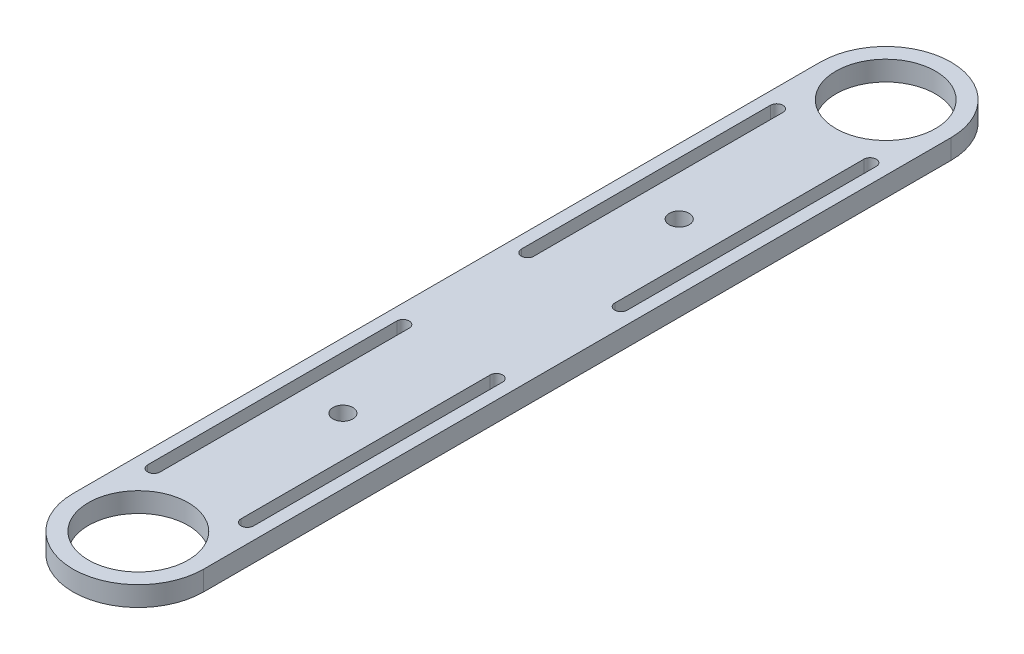
ISO-10303-21;
HEADER;
FILE_DESCRIPTION(('STEP AP214'),'2;1');
FILE_NAME('part.step','',(''),(''),'','','');
FILE_SCHEMA(('AUTOMOTIVE_DESIGN { 1 0 10303 214 1 1 1 1 }'));
ENDSEC;
DATA;
#1=APPLICATION_CONTEXT('core data for automotive mechanical design processes');
#2=APPLICATION_PROTOCOL_DEFINITION('international standard','automotive_design',2000,#1);
#3=PRODUCT_CONTEXT('',#1,'mechanical');
#4=PRODUCT('Part','Part','',(#3));
#5=PRODUCT_RELATED_PRODUCT_CATEGORY('part','',(#4));
#6=PRODUCT_DEFINITION_FORMATION('','',#4);
#7=PRODUCT_DEFINITION_CONTEXT('part definition',#1,'design');
#8=PRODUCT_DEFINITION('design','',#6,#7);
#9=PRODUCT_DEFINITION_SHAPE('','',#8);
#10=(LENGTH_UNIT() NAMED_UNIT(*) SI_UNIT(.MILLI.,.METRE.));
#11=(NAMED_UNIT(*) PLANE_ANGLE_UNIT() SI_UNIT($,.RADIAN.));
#12=(NAMED_UNIT(*) SI_UNIT($,.STERADIAN.) SOLID_ANGLE_UNIT());
#13=UNCERTAINTY_MEASURE_WITH_UNIT(LENGTH_MEASURE(1.E-05),#10,'distance_accuracy_value','');
#14=(GEOMETRIC_REPRESENTATION_CONTEXT(3) GLOBAL_UNCERTAINTY_ASSIGNED_CONTEXT((#13)) GLOBAL_UNIT_ASSIGNED_CONTEXT((#10,
#11,#12)) REPRESENTATION_CONTEXT('',''));
#15=CARTESIAN_POINT('',(0.,0.,0.));
#16=DIRECTION('',(0.,0.,1.));
#17=DIRECTION('',(1.,0.,0.));
#18=AXIS2_PLACEMENT_3D('',#15,#16,#17);
#19=CARTESIAN_POINT('',(0.,3.175,0.));
#20=DIRECTION('',(0.,-1.,0.));
#21=DIRECTION('',(0.,0.,-1.));
#22=AXIS2_PLACEMENT_3D('',#19,#20,#21);
#23=CYLINDRICAL_SURFACE('',#22,10.5);
#24=CARTESIAN_POINT('',(0.,0.,0.));
#25=DIRECTION('',(0.,1.,0.));
#26=DIRECTION('',(0.,0.,1.));
#27=AXIS2_PLACEMENT_3D('',#24,#25,#26);
#28=CIRCLE('',#27,10.5);
#29=CARTESIAN_POINT('',(10.5,0.,0.));
#30=VERTEX_POINT('',#29);
#31=CARTESIAN_POINT('',(-10.5,0.,0.));
#32=VERTEX_POINT('',#31);
#33=EDGE_CURVE('E273',#30,#32,#28,.T.);
#34=ORIENTED_EDGE('',*,*,#33,.T.);
#35=DIRECTION('',(0.,-1.,0.));
#36=VECTOR('',#35,1.);
#37=CARTESIAN_POINT('',(-10.5,3.175,0.));
#38=LINE('',#37,#36);
#39=CARTESIAN_POINT('',(-10.5,3.175,0.));
#40=VERTEX_POINT('',#39);
#41=EDGE_CURVE('E302',#40,#32,#38,.T.);
#42=ORIENTED_EDGE('',*,*,#41,.F.);
#43=CARTESIAN_POINT('',(0.,3.175,0.));
#44=DIRECTION('',(0.,1.,0.));
#45=DIRECTION('',(0.,0.,1.));
#46=AXIS2_PLACEMENT_3D('',#43,#44,#45);
#47=CIRCLE('',#46,10.5);
#48=CARTESIAN_POINT('',(10.5,3.175,0.));
#49=VERTEX_POINT('',#48);
#50=EDGE_CURVE('E276',#49,#40,#47,.T.);
#51=ORIENTED_EDGE('',*,*,#50,.F.);
#52=DIRECTION('',(0.,-1.,0.));
#53=VECTOR('',#52,1.);
#54=CARTESIAN_POINT('',(10.5,3.175,0.));
#55=LINE('',#54,#53);
#56=EDGE_CURVE('E286',#49,#30,#55,.T.);
#57=ORIENTED_EDGE('',*,*,#56,.T.);
#58=EDGE_LOOP('',(#34,#42,#51,#57));
#59=FACE_BOUND('',#58,.T.);
#60=ADVANCED_FACE('F33',(#59),#23,.T.);
#61=CARTESIAN_POINT('',(-10.5,3.175,0.));
#62=DIRECTION('',(1.,0.,0.));
#63=DIRECTION('',(0.,0.,-1.));
#64=AXIS2_PLACEMENT_3D('',#61,#62,#63);
#65=PLANE('',#64);
#66=DIRECTION('',(0.,0.,1.));
#67=VECTOR('',#66,1.);
#68=CARTESIAN_POINT('',(-10.5,0.,0.));
#69=LINE('',#68,#67);
#70=CARTESIAN_POINT('',(-10.5,0.,120.));
#71=VERTEX_POINT('',#70);
#72=EDGE_CURVE('E289',#32,#71,#69,.T.);
#73=ORIENTED_EDGE('',*,*,#72,.T.);
#74=DIRECTION('',(0.,-1.,0.));
#75=VECTOR('',#74,1.);
#76=CARTESIAN_POINT('',(-10.5,3.175,120.));
#77=LINE('',#76,#75);
#78=CARTESIAN_POINT('',(-10.5,3.175,120.));
#79=VERTEX_POINT('',#78);
#80=EDGE_CURVE('E299',#79,#71,#77,.T.);
#81=ORIENTED_EDGE('',*,*,#80,.F.);
#82=DIRECTION('',(0.,0.,1.));
#83=VECTOR('',#82,1.);
#84=CARTESIAN_POINT('',(-10.5,3.175,0.));
#85=LINE('',#84,#83);
#86=EDGE_CURVE('E279',#40,#79,#85,.T.);
#87=ORIENTED_EDGE('',*,*,#86,.F.);
#88=ORIENTED_EDGE('',*,*,#41,.T.);
#89=EDGE_LOOP('',(#73,#81,#87,#88));
#90=FACE_BOUND('',#89,.T.);
#91=ADVANCED_FACE('F368',(#90),#65,.F.);
#92=CARTESIAN_POINT('',(0.,3.175,120.));
#93=DIRECTION('',(0.,-1.,0.));
#94=DIRECTION('',(0.,0.,-1.));
#95=AXIS2_PLACEMENT_3D('',#92,#93,#94);
#96=CYLINDRICAL_SURFACE('',#95,10.5);
#97=CARTESIAN_POINT('',(0.,0.,120.));
#98=DIRECTION('',(0.,1.,0.));
#99=DIRECTION('',(0.,0.,1.));
#100=AXIS2_PLACEMENT_3D('',#97,#98,#99);
#101=CIRCLE('',#100,10.5);
#102=CARTESIAN_POINT('',(10.5,0.,120.));
#103=VERTEX_POINT('',#102);
#104=EDGE_CURVE('E291',#71,#103,#101,.T.);
#105=ORIENTED_EDGE('',*,*,#104,.T.);
#106=DIRECTION('',(0.,-1.,0.));
#107=VECTOR('',#106,1.);
#108=CARTESIAN_POINT('',(10.5,3.175,120.));
#109=LINE('',#108,#107);
#110=CARTESIAN_POINT('',(10.5,3.175,120.));
#111=VERTEX_POINT('',#110);
#112=EDGE_CURVE('E296',#111,#103,#109,.T.);
#113=ORIENTED_EDGE('',*,*,#112,.F.);
#114=CARTESIAN_POINT('',(0.,3.175,120.));
#115=DIRECTION('',(0.,1.,0.));
#116=DIRECTION('',(0.,0.,1.));
#117=AXIS2_PLACEMENT_3D('',#114,#115,#116);
#118=CIRCLE('',#117,10.5);
#119=EDGE_CURVE('E282',#79,#111,#118,.T.);
#120=ORIENTED_EDGE('',*,*,#119,.F.);
#121=ORIENTED_EDGE('',*,*,#80,.T.);
#122=EDGE_LOOP('',(#105,#113,#120,#121));
#123=FACE_BOUND('',#122,.T.);
#124=ADVANCED_FACE('F373',(#123),#96,.T.);
#125=CARTESIAN_POINT('',(10.5,3.175,0.));
#126=DIRECTION('',(-1.,0.,0.));
#127=DIRECTION('',(0.,0.,1.));
#128=AXIS2_PLACEMENT_3D('',#125,#126,#127);
#129=PLANE('',#128);
#130=DIRECTION('',(0.,0.,-1.));
#131=VECTOR('',#130,1.);
#132=CARTESIAN_POINT('',(10.5,0.,0.));
#133=LINE('',#132,#131);
#134=EDGE_CURVE('E280',#103,#30,#133,.T.);
#135=ORIENTED_EDGE('',*,*,#134,.T.);
#136=ORIENTED_EDGE('',*,*,#56,.F.);
#137=DIRECTION('',(0.,0.,-1.));
#138=VECTOR('',#137,1.);
#139=CARTESIAN_POINT('',(10.5,3.175,0.));
#140=LINE('',#139,#138);
#141=EDGE_CURVE('E284',#111,#49,#140,.T.);
#142=ORIENTED_EDGE('',*,*,#141,.F.);
#143=ORIENTED_EDGE('',*,*,#112,.T.);
#144=EDGE_LOOP('',(#135,#136,#142,#143));
#145=FACE_BOUND('',#144,.T.);
#146=ADVANCED_FACE('F388',(#145),#129,.F.);
#147=CARTESIAN_POINT('',(0.,3.175,0.));
#148=DIRECTION('',(0.,1.,0.));
#149=DIRECTION('',(0.,0.,1.));
#150=AXIS2_PLACEMENT_3D('',#147,#148,#149);
#151=PLANE('',#150);
#152=CARTESIAN_POINT('',(0.,3.175,4.36317648677687E-11));
#153=DIRECTION('',(0.,1.,0.));
#154=DIRECTION('',(0.,0.,1.));
#155=AXIS2_PLACEMENT_3D('',#152,#153,#154);
#156=CIRCLE('',#155,8.);
#157=CARTESIAN_POINT('',(0.,3.175,8.00000000004363));
#158=VERTEX_POINT('',#157);
#159=EDGE_CURVE('E486',#158,#158,#156,.T.);
#160=ORIENTED_EDGE('',*,*,#159,.F.);
#161=EDGE_LOOP('',(#160));
#162=FACE_BOUND('',#161,.T.);
#163=CARTESIAN_POINT('',(1.71307412699662E-10,3.175,119.999999999655));
#164=DIRECTION('',(0.,1.,0.));
#165=DIRECTION('',(0.,0.,1.));
#166=AXIS2_PLACEMENT_3D('',#163,#164,#165);
#167=CIRCLE('',#166,7.99999999999998);
#168=CARTESIAN_POINT('',(1.71307412699662E-10,3.175,127.999999999655));
#169=VERTEX_POINT('',#168);
#170=EDGE_CURVE('E490',#169,#169,#167,.T.);
#171=ORIENTED_EDGE('',*,*,#170,.F.);
#172=EDGE_LOOP('',(#171));
#173=FACE_BOUND('',#172,.T.);
#174=CARTESIAN_POINT('',(0.,3.175,33.1500000000001));
#175=DIRECTION('',(0.,1.,0.));
#176=DIRECTION('',(0.,0.,1.));
#177=AXIS2_PLACEMENT_3D('',#174,#175,#176);
#178=CIRCLE('',#177,1.6);
#179=CARTESIAN_POINT('',(0.,3.175,34.7500000000001));
#180=VERTEX_POINT('',#179);
#181=EDGE_CURVE('E206',#180,#180,#178,.T.);
#182=ORIENTED_EDGE('',*,*,#181,.F.);
#183=EDGE_LOOP('',(#182));
#184=FACE_BOUND('',#183,.T.);
#185=CARTESIAN_POINT('',(0.,3.175,87.1500000000001));
#186=DIRECTION('',(0.,1.,0.));
#187=DIRECTION('',(0.,0.,1.));
#188=AXIS2_PLACEMENT_3D('',#185,#186,#187);
#189=CIRCLE('',#188,1.59999999999999);
#190=CARTESIAN_POINT('',(0.,3.175,88.7500000000001));
#191=VERTEX_POINT('',#190);
#192=EDGE_CURVE('E503',#191,#191,#189,.T.);
#193=ORIENTED_EDGE('',*,*,#192,.F.);
#194=EDGE_LOOP('',(#193));
#195=FACE_BOUND('',#194,.T.);
#196=CARTESIAN_POINT('',(-7.50000000000003,3.175,50.));
#197=DIRECTION('',(0.,-1.,0.));
#198=DIRECTION('',(0.,0.,-1.));
#199=AXIS2_PLACEMENT_3D('',#196,#197,#198);
#200=CIRCLE('',#199,0.999999999999999);
#201=CARTESIAN_POINT('',(-6.50000000000003,3.175,50.));
#202=VERTEX_POINT('',#201);
#203=CARTESIAN_POINT('',(-8.50000000000002,3.175,50.));
#204=VERTEX_POINT('',#203);
#205=EDGE_CURVE('E238',#202,#204,#200,.T.);
#206=ORIENTED_EDGE('',*,*,#205,.T.);
#207=DIRECTION('',(0.,0.,-1.));
#208=VECTOR('',#207,1.);
#209=CARTESIAN_POINT('',(-8.50000000000002,3.175,50.));
#210=LINE('',#209,#208);
#211=CARTESIAN_POINT('',(-8.50000000000002,3.175,10.));
#212=VERTEX_POINT('',#211);
#213=EDGE_CURVE('E241',#204,#212,#210,.T.);
#214=ORIENTED_EDGE('',*,*,#213,.T.);
#215=CARTESIAN_POINT('',(-7.50000000000003,3.175,10.));
#216=DIRECTION('',(0.,-1.,0.));
#217=DIRECTION('',(0.,0.,-1.));
#218=AXIS2_PLACEMENT_3D('',#215,#216,#217);
#219=CIRCLE('',#218,0.999999999999999);
#220=CARTESIAN_POINT('',(-6.50000000000003,3.175,10.));
#221=VERTEX_POINT('',#220);
#222=EDGE_CURVE('E49',#212,#221,#219,.T.);
#223=ORIENTED_EDGE('',*,*,#222,.T.);
#224=DIRECTION('',(0.,0.,1.));
#225=VECTOR('',#224,1.);
#226=CARTESIAN_POINT('',(-6.50000000000003,3.175,10.));
#227=LINE('',#226,#225);
#228=EDGE_CURVE('E245',#221,#202,#227,.T.);
#229=ORIENTED_EDGE('',*,*,#228,.T.);
#230=EDGE_LOOP('',(#206,#214,#223,#229));
#231=FACE_BOUND('',#230,.T.);
#232=CARTESIAN_POINT('',(7.49999999999997,3.175,10.));
#233=DIRECTION('',(0.,-1.,0.));
#234=DIRECTION('',(0.,0.,-1.));
#235=AXIS2_PLACEMENT_3D('',#232,#233,#234);
#236=CIRCLE('',#235,0.999999999999997);
#237=CARTESIAN_POINT('',(6.49999999999997,3.175,10.));
#238=VERTEX_POINT('',#237);
#239=CARTESIAN_POINT('',(8.49999999999997,3.175,10.));
#240=VERTEX_POINT('',#239);
#241=EDGE_CURVE('E218',#238,#240,#236,.T.);
#242=ORIENTED_EDGE('',*,*,#241,.T.);
#243=DIRECTION('',(0.,0.,1.));
#244=VECTOR('',#243,1.);
#245=CARTESIAN_POINT('',(8.49999999999997,3.175,10.));
#246=LINE('',#245,#244);
#247=CARTESIAN_POINT('',(8.49999999999997,3.175,50.));
#248=VERTEX_POINT('',#247);
#249=EDGE_CURVE('E221',#240,#248,#246,.T.);
#250=ORIENTED_EDGE('',*,*,#249,.T.);
#251=CARTESIAN_POINT('',(7.49999999999997,3.175,50.));
#252=DIRECTION('',(0.,-1.,0.));
#253=DIRECTION('',(0.,0.,-1.));
#254=AXIS2_PLACEMENT_3D('',#251,#252,#253);
#255=CIRCLE('',#254,0.999999999999999);
#256=CARTESIAN_POINT('',(6.49999999999997,3.175,50.));
#257=VERTEX_POINT('',#256);
#258=EDGE_CURVE('E225',#248,#257,#255,.T.);
#259=ORIENTED_EDGE('',*,*,#258,.T.);
#260=DIRECTION('',(0.,0.,-1.));
#261=VECTOR('',#260,1.);
#262=CARTESIAN_POINT('',(6.49999999999997,3.175,50.));
#263=LINE('',#262,#261);
#264=EDGE_CURVE('E228',#257,#238,#263,.T.);
#265=ORIENTED_EDGE('',*,*,#264,.T.);
#266=EDGE_LOOP('',(#242,#250,#259,#265));
#267=FACE_BOUND('',#266,.T.);
#268=CARTESIAN_POINT('',(7.49999999999984,3.175,110.));
#269=DIRECTION('',(0.,-1.,0.));
#270=DIRECTION('',(0.,0.,-1.));
#271=AXIS2_PLACEMENT_3D('',#268,#269,#270);
#272=CIRCLE('',#271,0.999999999999999);
#273=CARTESIAN_POINT('',(8.49999999999997,3.175,110.));
#274=VERTEX_POINT('',#273);
#275=CARTESIAN_POINT('',(6.49999999999997,3.175,110.));
#276=VERTEX_POINT('',#275);
#277=EDGE_CURVE('E179',#274,#276,#272,.T.);
#278=ORIENTED_EDGE('',*,*,#277,.T.);
#279=DIRECTION('',(0.,0.,-1.));
#280=VECTOR('',#279,1.);
#281=CARTESIAN_POINT('',(6.49999999999997,3.175,110.));
#282=LINE('',#281,#280);
#283=CARTESIAN_POINT('',(6.49999999999994,3.175,70.));
#284=VERTEX_POINT('',#283);
#285=EDGE_CURVE('E190',#276,#284,#282,.T.);
#286=ORIENTED_EDGE('',*,*,#285,.T.);
#287=CARTESIAN_POINT('',(7.49999999999994,3.175,70.0000000000001));
#288=DIRECTION('',(0.,-1.,0.));
#289=DIRECTION('',(0.,0.,-1.));
#290=AXIS2_PLACEMENT_3D('',#287,#288,#289);
#291=CIRCLE('',#290,1.00000000000001);
#292=CARTESIAN_POINT('',(8.49999999999997,3.175,70.));
#293=VERTEX_POINT('',#292);
#294=EDGE_CURVE('E195',#284,#293,#291,.T.);
#295=ORIENTED_EDGE('',*,*,#294,.T.);
#296=DIRECTION('',(0.,0.,1.));
#297=VECTOR('',#296,1.);
#298=CARTESIAN_POINT('',(8.49999999999997,3.175,70.));
#299=LINE('',#298,#297);
#300=EDGE_CURVE('E186',#293,#274,#299,.T.);
#301=ORIENTED_EDGE('',*,*,#300,.T.);
#302=EDGE_LOOP('',(#278,#286,#295,#301));
#303=FACE_BOUND('',#302,.T.);
#304=CARTESIAN_POINT('',(-7.50000000000005,3.175,70.));
#305=DIRECTION('',(0.,-1.,0.));
#306=DIRECTION('',(0.,0.,-1.));
#307=AXIS2_PLACEMENT_3D('',#304,#305,#306);
#308=CIRCLE('',#307,0.999999999999999);
#309=CARTESIAN_POINT('',(-8.50000000000002,3.175,70.));
#310=VERTEX_POINT('',#309);
#311=CARTESIAN_POINT('',(-6.50000000000003,3.175,70.));
#312=VERTEX_POINT('',#311);
#313=EDGE_CURVE('E215',#310,#312,#308,.T.);
#314=ORIENTED_EDGE('',*,*,#313,.T.);
#315=DIRECTION('',(0.,0.,1.));
#316=VECTOR('',#315,1.);
#317=CARTESIAN_POINT('',(-6.50000000000003,3.175,70.));
#318=LINE('',#317,#316);
#319=CARTESIAN_POINT('',(-6.50000000000003,3.175,110.));
#320=VERTEX_POINT('',#319);
#321=EDGE_CURVE('E258',#312,#320,#318,.T.);
#322=ORIENTED_EDGE('',*,*,#321,.T.);
#323=CARTESIAN_POINT('',(-7.50000000000016,3.175,110.));
#324=DIRECTION('',(0.,-1.,0.));
#325=DIRECTION('',(0.,0.,-1.));
#326=AXIS2_PLACEMENT_3D('',#323,#324,#325);
#327=CIRCLE('',#326,1.00000000000007);
#328=CARTESIAN_POINT('',(-8.50000000000016,3.175,110.));
#329=VERTEX_POINT('',#328);
#330=EDGE_CURVE('E113',#320,#329,#327,.T.);
#331=ORIENTED_EDGE('',*,*,#330,.T.);
#332=DIRECTION('',(0.,0.,-1.));
#333=VECTOR('',#332,1.);
#334=CARTESIAN_POINT('',(-8.50000000000016,3.175,110.));
#335=LINE('',#334,#333);
#336=EDGE_CURVE('E262',#329,#310,#335,.T.);
#337=ORIENTED_EDGE('',*,*,#336,.T.);
#338=EDGE_LOOP('',(#314,#322,#331,#337));
#339=FACE_BOUND('',#338,.T.);
#340=ORIENTED_EDGE('',*,*,#50,.T.);
#341=ORIENTED_EDGE('',*,*,#86,.T.);
#342=ORIENTED_EDGE('',*,*,#119,.T.);
#343=ORIENTED_EDGE('',*,*,#141,.T.);
#344=EDGE_LOOP('',(#340,#341,#342,#343));
#345=FACE_BOUND('',#344,.T.);
#346=ADVANCED_FACE('F197',(#162,#173,#184,#195,#231,#267,#303,#339,#345),#151,.T.);
#347=CARTESIAN_POINT('',(0.,0.,0.));
#348=DIRECTION('',(0.,1.,0.));
#349=DIRECTION('',(0.,0.,1.));
#350=AXIS2_PLACEMENT_3D('',#347,#348,#349);
#351=PLANE('',#350);
#352=CARTESIAN_POINT('',(0.,0.,4.36317648677687E-11));
#353=DIRECTION('',(0.,1.,0.));
#354=DIRECTION('',(0.,0.,1.));
#355=AXIS2_PLACEMENT_3D('',#352,#353,#354);
#356=CIRCLE('',#355,8.);
#357=CARTESIAN_POINT('',(0.,0.,8.00000000004363));
#358=VERTEX_POINT('',#357);
#359=EDGE_CURVE('E489',#358,#358,#356,.T.);
#360=ORIENTED_EDGE('',*,*,#359,.T.);
#361=EDGE_LOOP('',(#360));
#362=FACE_BOUND('',#361,.T.);
#363=CARTESIAN_POINT('',(1.71307412699662E-10,0.,119.999999999655));
#364=DIRECTION('',(0.,1.,0.));
#365=DIRECTION('',(0.,0.,1.));
#366=AXIS2_PLACEMENT_3D('',#363,#364,#365);
#367=CIRCLE('',#366,7.99999999999998);
#368=CARTESIAN_POINT('',(1.71307412699662E-10,0.,127.999999999655));
#369=VERTEX_POINT('',#368);
#370=EDGE_CURVE('E491',#369,#369,#367,.T.);
#371=ORIENTED_EDGE('',*,*,#370,.T.);
#372=EDGE_LOOP('',(#371));
#373=FACE_BOUND('',#372,.T.);
#374=CARTESIAN_POINT('',(0.,0.,33.1500000000001));
#375=DIRECTION('',(0.,1.,0.));
#376=DIRECTION('',(0.,0.,1.));
#377=AXIS2_PLACEMENT_3D('',#374,#375,#376);
#378=CIRCLE('',#377,1.6);
#379=CARTESIAN_POINT('',(0.,0.,34.7500000000001));
#380=VERTEX_POINT('',#379);
#381=EDGE_CURVE('E500',#380,#380,#378,.T.);
#382=ORIENTED_EDGE('',*,*,#381,.T.);
#383=EDGE_LOOP('',(#382));
#384=FACE_BOUND('',#383,.T.);
#385=CARTESIAN_POINT('',(0.,0.,87.1500000000001));
#386=DIRECTION('',(0.,1.,0.));
#387=DIRECTION('',(0.,0.,1.));
#388=AXIS2_PLACEMENT_3D('',#385,#386,#387);
#389=CIRCLE('',#388,1.59999999999999);
#390=CARTESIAN_POINT('',(0.,0.,88.7500000000001));
#391=VERTEX_POINT('',#390);
#392=EDGE_CURVE('E499',#391,#391,#389,.T.);
#393=ORIENTED_EDGE('',*,*,#392,.T.);
#394=EDGE_LOOP('',(#393));
#395=FACE_BOUND('',#394,.T.);
#396=DIRECTION('',(0.,0.,1.));
#397=VECTOR('',#396,1.);
#398=CARTESIAN_POINT('',(-8.50000000000002,0.,0.));
#399=LINE('',#398,#397);
#400=CARTESIAN_POINT('',(-8.50000000000002,0.,10.));
#401=VERTEX_POINT('',#400);
#402=CARTESIAN_POINT('',(-8.50000000000002,0.,50.));
#403=VERTEX_POINT('',#402);
#404=EDGE_CURVE('E338',#401,#403,#399,.T.);
#405=ORIENTED_EDGE('',*,*,#404,.T.);
#406=CARTESIAN_POINT('',(-7.50000000000003,0.,50.));
#407=DIRECTION('',(0.,-1.,0.));
#408=DIRECTION('',(0.,0.,-1.));
#409=AXIS2_PLACEMENT_3D('',#406,#407,#408);
#410=CIRCLE('',#409,0.999999999999999);
#411=CARTESIAN_POINT('',(-6.50000000000003,0.,50.));
#412=VERTEX_POINT('',#411);
#413=EDGE_CURVE('E11',#403,#412,#410,.F.);
#414=ORIENTED_EDGE('',*,*,#413,.T.);
#415=DIRECTION('',(0.,0.,1.));
#416=VECTOR('',#415,1.);
#417=CARTESIAN_POINT('',(-6.50000000000003,0.,0.));
#418=LINE('',#417,#416);
#419=CARTESIAN_POINT('',(-6.50000000000003,0.,10.));
#420=VERTEX_POINT('',#419);
#421=EDGE_CURVE('E41',#412,#420,#418,.F.);
#422=ORIENTED_EDGE('',*,*,#421,.T.);
#423=CARTESIAN_POINT('',(-7.50000000000003,0.,10.));
#424=DIRECTION('',(0.,-1.,0.));
#425=DIRECTION('',(0.,0.,-1.));
#426=AXIS2_PLACEMENT_3D('',#423,#424,#425);
#427=CIRCLE('',#426,0.999999999999999);
#428=EDGE_CURVE('E341',#420,#401,#427,.F.);
#429=ORIENTED_EDGE('',*,*,#428,.T.);
#430=EDGE_LOOP('',(#405,#414,#422,#429));
#431=FACE_BOUND('',#430,.T.);
#432=DIRECTION('',(0.,0.,1.));
#433=VECTOR('',#432,1.);
#434=CARTESIAN_POINT('',(8.49999999999997,0.,0.));
#435=LINE('',#434,#433);
#436=CARTESIAN_POINT('',(8.49999999999997,0.,50.));
#437=VERTEX_POINT('',#436);
#438=CARTESIAN_POINT('',(8.49999999999997,0.,10.));
#439=VERTEX_POINT('',#438);
#440=EDGE_CURVE('E326',#437,#439,#435,.F.);
#441=ORIENTED_EDGE('',*,*,#440,.T.);
#442=CARTESIAN_POINT('',(7.49999999999997,0.,10.));
#443=DIRECTION('',(0.,-1.,0.));
#444=DIRECTION('',(0.,0.,-1.));
#445=AXIS2_PLACEMENT_3D('',#442,#443,#444);
#446=CIRCLE('',#445,0.999999999999997);
#447=CARTESIAN_POINT('',(6.49999999999997,0.,10.));
#448=VERTEX_POINT('',#447);
#449=EDGE_CURVE('E335',#439,#448,#446,.F.);
#450=ORIENTED_EDGE('',*,*,#449,.T.);
#451=DIRECTION('',(0.,0.,1.));
#452=VECTOR('',#451,1.);
#453=CARTESIAN_POINT('',(6.49999999999997,0.,0.));
#454=LINE('',#453,#452);
#455=CARTESIAN_POINT('',(6.49999999999997,0.,50.));
#456=VERTEX_POINT('',#455);
#457=EDGE_CURVE('E332',#448,#456,#454,.T.);
#458=ORIENTED_EDGE('',*,*,#457,.T.);
#459=CARTESIAN_POINT('',(7.49999999999997,0.,50.));
#460=DIRECTION('',(0.,-1.,0.));
#461=DIRECTION('',(0.,0.,-1.));
#462=AXIS2_PLACEMENT_3D('',#459,#460,#461);
#463=CIRCLE('',#462,0.999999999999999);
#464=EDGE_CURVE('E329',#456,#437,#463,.F.);
#465=ORIENTED_EDGE('',*,*,#464,.T.);
#466=EDGE_LOOP('',(#441,#450,#458,#465));
#467=FACE_BOUND('',#466,.T.);
#468=DIRECTION('',(0.,0.,1.));
#469=VECTOR('',#468,1.);
#470=CARTESIAN_POINT('',(6.49999999999994,0.,0.));
#471=LINE('',#470,#469);
#472=CARTESIAN_POINT('',(6.49999999999993,0.,70.));
#473=VERTEX_POINT('',#472);
#474=CARTESIAN_POINT('',(6.49999999999996,0.,110.));
#475=VERTEX_POINT('',#474);
#476=EDGE_CURVE('E317',#473,#475,#471,.T.);
#477=ORIENTED_EDGE('',*,*,#476,.T.);
#478=CARTESIAN_POINT('',(7.49999999999984,0.,110.));
#479=DIRECTION('',(0.,-1.,0.));
#480=DIRECTION('',(0.,0.,-1.));
#481=AXIS2_PLACEMENT_3D('',#478,#479,#480);
#482=CIRCLE('',#481,0.999999999999999);
#483=CARTESIAN_POINT('',(8.49999999999997,0.,110.));
#484=VERTEX_POINT('',#483);
#485=EDGE_CURVE('E182',#475,#484,#482,.F.);
#486=ORIENTED_EDGE('',*,*,#485,.T.);
#487=DIRECTION('',(0.,0.,1.));
#488=VECTOR('',#487,1.);
#489=CARTESIAN_POINT('',(8.49999999999997,0.,0.));
#490=LINE('',#489,#488);
#491=CARTESIAN_POINT('',(8.49999999999997,0.,70.));
#492=VERTEX_POINT('',#491);
#493=EDGE_CURVE('E322',#484,#492,#490,.F.);
#494=ORIENTED_EDGE('',*,*,#493,.T.);
#495=CARTESIAN_POINT('',(7.49999999999994,0.,70.0000000000001));
#496=DIRECTION('',(0.,-1.,0.));
#497=DIRECTION('',(0.,0.,-1.));
#498=AXIS2_PLACEMENT_3D('',#495,#496,#497);
#499=CIRCLE('',#498,1.00000000000001);
#500=EDGE_CURVE('E319',#492,#473,#499,.F.);
#501=ORIENTED_EDGE('',*,*,#500,.T.);
#502=EDGE_LOOP('',(#477,#486,#494,#501));
#503=FACE_BOUND('',#502,.T.);
#504=DIRECTION('',(0.,0.,1.));
#505=VECTOR('',#504,1.);
#506=CARTESIAN_POINT('',(-6.50000000000003,0.,0.));
#507=LINE('',#506,#505);
#508=CARTESIAN_POINT('',(-6.50000000000006,0.,110.));
#509=VERTEX_POINT('',#508);
#510=CARTESIAN_POINT('',(-6.50000000000003,0.,70.));
#511=VERTEX_POINT('',#510);
#512=EDGE_CURVE('E305',#509,#511,#507,.F.);
#513=ORIENTED_EDGE('',*,*,#512,.T.);
#514=CARTESIAN_POINT('',(-7.50000000000005,0.,70.));
#515=DIRECTION('',(0.,-1.,0.));
#516=DIRECTION('',(0.,0.,-1.));
#517=AXIS2_PLACEMENT_3D('',#514,#515,#516);
#518=CIRCLE('',#517,0.999999999999999);
#519=CARTESIAN_POINT('',(-8.50000000000002,0.,70.));
#520=VERTEX_POINT('',#519);
#521=EDGE_CURVE('E314',#511,#520,#518,.F.);
#522=ORIENTED_EDGE('',*,*,#521,.T.);
#523=DIRECTION('',(0.,0.,1.));
#524=VECTOR('',#523,1.);
#525=CARTESIAN_POINT('',(-8.50000000000002,0.,0.));
#526=LINE('',#525,#524);
#527=CARTESIAN_POINT('',(-8.50000000000009,0.,110.));
#528=VERTEX_POINT('',#527);
#529=EDGE_CURVE('E311',#520,#528,#526,.T.);
#530=ORIENTED_EDGE('',*,*,#529,.T.);
#531=CARTESIAN_POINT('',(-7.50000000000016,0.,110.));
#532=DIRECTION('',(0.,-1.,0.));
#533=DIRECTION('',(0.,0.,-1.));
#534=AXIS2_PLACEMENT_3D('',#531,#532,#533);
#535=CIRCLE('',#534,1.00000000000007);
#536=EDGE_CURVE('E308',#528,#509,#535,.F.);
#537=ORIENTED_EDGE('',*,*,#536,.T.);
#538=EDGE_LOOP('',(#513,#522,#530,#537));
#539=FACE_BOUND('',#538,.T.);
#540=ORIENTED_EDGE('',*,*,#33,.F.);
#541=ORIENTED_EDGE('',*,*,#134,.F.);
#542=ORIENTED_EDGE('',*,*,#104,.F.);
#543=ORIENTED_EDGE('',*,*,#72,.F.);
#544=EDGE_LOOP('',(#540,#541,#542,#543));
#545=FACE_BOUND('',#544,.T.);
#546=ADVANCED_FACE('F346',(#362,#373,#384,#395,#431,#467,#503,#539,#545),#351,.F.);
#547=CARTESIAN_POINT('',(-7.50000000000005,3.175,70.));
#548=DIRECTION('',(0.,-1.,0.));
#549=DIRECTION('',(0.,0.,-1.));
#550=AXIS2_PLACEMENT_3D('',#547,#548,#549);
#551=CYLINDRICAL_SURFACE('',#550,0.999999999999999);
#552=DIRECTION('',(0.,-1.,0.));
#553=VECTOR('',#552,1.);
#554=CARTESIAN_POINT('',(-6.50000000000003,3.175,70.));
#555=LINE('',#554,#553);
#556=EDGE_CURVE('E265',#312,#511,#555,.T.);
#557=ORIENTED_EDGE('',*,*,#556,.F.);
#558=ORIENTED_EDGE('',*,*,#313,.F.);
#559=DIRECTION('',(0.,-1.,0.));
#560=VECTOR('',#559,1.);
#561=CARTESIAN_POINT('',(-8.50000000000002,3.175,70.));
#562=LINE('',#561,#560);
#563=EDGE_CURVE('E269',#310,#520,#562,.T.);
#564=ORIENTED_EDGE('',*,*,#563,.T.);
#565=ORIENTED_EDGE('',*,*,#521,.F.);
#566=EDGE_LOOP('',(#557,#558,#564,#565));
#567=FACE_BOUND('',#566,.T.);
#568=ADVANCED_FACE('F399',(#567),#551,.F.);
#569=CARTESIAN_POINT('',(-8.50000000000016,3.175,110.));
#570=DIRECTION('',(-1.,0.,0.));
#571=DIRECTION('',(0.,0.,1.));
#572=AXIS2_PLACEMENT_3D('',#569,#570,#571);
#573=PLANE('',#572);
#574=ORIENTED_EDGE('',*,*,#563,.F.);
#575=ORIENTED_EDGE('',*,*,#336,.F.);
#576=DIRECTION('',(0.,-1.,0.));
#577=VECTOR('',#576,1.);
#578=CARTESIAN_POINT('',(-8.50000000000016,3.175,110.));
#579=LINE('',#578,#577);
#580=EDGE_CURVE('E266',#329,#528,#579,.T.);
#581=ORIENTED_EDGE('',*,*,#580,.T.);
#582=ORIENTED_EDGE('',*,*,#529,.F.);
#583=EDGE_LOOP('',(#574,#575,#581,#582));
#584=FACE_BOUND('',#583,.T.);
#585=ADVANCED_FACE('F406',(#584),#573,.F.);
#586=CARTESIAN_POINT('',(-7.50000000000016,3.175,110.));
#587=DIRECTION('',(0.,-1.,0.));
#588=DIRECTION('',(0.,0.,-1.));
#589=AXIS2_PLACEMENT_3D('',#586,#587,#588);
#590=CYLINDRICAL_SURFACE('',#589,1.00000000000007);
#591=ORIENTED_EDGE('',*,*,#580,.F.);
#592=ORIENTED_EDGE('',*,*,#330,.F.);
#593=DIRECTION('',(0.,-1.,0.));
#594=VECTOR('',#593,1.);
#595=CARTESIAN_POINT('',(-6.50000000000009,3.175,110.));
#596=LINE('',#595,#594);
#597=EDGE_CURVE('E270',#320,#509,#596,.T.);
#598=ORIENTED_EDGE('',*,*,#597,.T.);
#599=ORIENTED_EDGE('',*,*,#536,.F.);
#600=EDGE_LOOP('',(#591,#592,#598,#599));
#601=FACE_BOUND('',#600,.T.);
#602=ADVANCED_FACE('F411',(#601),#590,.F.);
#603=CARTESIAN_POINT('',(-6.50000000000003,3.175,70.));
#604=DIRECTION('',(1.,0.,0.));
#605=DIRECTION('',(0.,0.,-1.));
#606=AXIS2_PLACEMENT_3D('',#603,#604,#605);
#607=PLANE('',#606);
#608=ORIENTED_EDGE('',*,*,#597,.F.);
#609=ORIENTED_EDGE('',*,*,#321,.F.);
#610=ORIENTED_EDGE('',*,*,#556,.T.);
#611=ORIENTED_EDGE('',*,*,#512,.F.);
#612=EDGE_LOOP('',(#608,#609,#610,#611));
#613=FACE_BOUND('',#612,.T.);
#614=ADVANCED_FACE('F408',(#613),#607,.F.);
#615=CARTESIAN_POINT('',(7.49999999999984,3.175,110.));
#616=DIRECTION('',(0.,-1.,0.));
#617=DIRECTION('',(0.,0.,-1.));
#618=AXIS2_PLACEMENT_3D('',#615,#616,#617);
#619=CYLINDRICAL_SURFACE('',#618,0.999999999999999);
#620=DIRECTION('',(0.,-1.,0.));
#621=VECTOR('',#620,1.);
#622=CARTESIAN_POINT('',(6.49999999999997,3.175,110.));
#623=LINE('',#622,#621);
#624=EDGE_CURVE('E174',#276,#475,#623,.T.);
#625=ORIENTED_EDGE('',*,*,#624,.F.);
#626=ORIENTED_EDGE('',*,*,#277,.F.);
#627=DIRECTION('',(0.,-1.,0.));
#628=VECTOR('',#627,1.);
#629=CARTESIAN_POINT('',(8.49999999999997,3.175,110.));
#630=LINE('',#629,#628);
#631=EDGE_CURVE('E214',#274,#484,#630,.T.);
#632=ORIENTED_EDGE('',*,*,#631,.T.);
#633=ORIENTED_EDGE('',*,*,#485,.F.);
#634=EDGE_LOOP('',(#625,#626,#632,#633));
#635=FACE_BOUND('',#634,.T.);
#636=ADVANCED_FACE('F176',(#635),#619,.F.);
#637=CARTESIAN_POINT('',(8.49999999999997,3.175,70.));
#638=DIRECTION('',(1.,0.,0.));
#639=DIRECTION('',(0.,0.,-1.));
#640=AXIS2_PLACEMENT_3D('',#637,#638,#639);
#641=PLANE('',#640);
#642=ORIENTED_EDGE('',*,*,#631,.F.);
#643=ORIENTED_EDGE('',*,*,#300,.F.);
#644=DIRECTION('',(0.,-1.,0.));
#645=VECTOR('',#644,1.);
#646=CARTESIAN_POINT('',(8.49999999999997,3.175,70.));
#647=LINE('',#646,#645);
#648=EDGE_CURVE('E211',#293,#492,#647,.T.);
#649=ORIENTED_EDGE('',*,*,#648,.T.);
#650=ORIENTED_EDGE('',*,*,#493,.F.);
#651=EDGE_LOOP('',(#642,#643,#649,#650));
#652=FACE_BOUND('',#651,.T.);
#653=ADVANCED_FACE('F457',(#652),#641,.F.);
#654=CARTESIAN_POINT('',(7.49999999999994,3.175,70.0000000000001));
#655=DIRECTION('',(0.,-1.,0.));
#656=DIRECTION('',(0.,0.,-1.));
#657=AXIS2_PLACEMENT_3D('',#654,#655,#656);
#658=CYLINDRICAL_SURFACE('',#657,1.00000000000001);
#659=ORIENTED_EDGE('',*,*,#648,.F.);
#660=ORIENTED_EDGE('',*,*,#294,.F.);
#661=DIRECTION('',(0.,-1.,0.));
#662=VECTOR('',#661,1.);
#663=CARTESIAN_POINT('',(6.49999999999993,3.175,70.));
#664=LINE('',#663,#662);
#665=EDGE_CURVE('E185',#284,#473,#664,.T.);
#666=ORIENTED_EDGE('',*,*,#665,.T.);
#667=ORIENTED_EDGE('',*,*,#500,.F.);
#668=EDGE_LOOP('',(#659,#660,#666,#667));
#669=FACE_BOUND('',#668,.T.);
#670=ADVANCED_FACE('F443',(#669),#658,.F.);
#671=CARTESIAN_POINT('',(6.49999999999997,3.175,110.));
#672=DIRECTION('',(-1.,0.,0.));
#673=DIRECTION('',(0.,0.,1.));
#674=AXIS2_PLACEMENT_3D('',#671,#672,#673);
#675=PLANE('',#674);
#676=ORIENTED_EDGE('',*,*,#665,.F.);
#677=ORIENTED_EDGE('',*,*,#285,.F.);
#678=ORIENTED_EDGE('',*,*,#624,.T.);
#679=ORIENTED_EDGE('',*,*,#476,.F.);
#680=EDGE_LOOP('',(#676,#677,#678,#679));
#681=FACE_BOUND('',#680,.T.);
#682=ADVANCED_FACE('F191',(#681),#675,.F.);
#683=CARTESIAN_POINT('',(7.49999999999997,3.175,10.));
#684=DIRECTION('',(0.,-1.,0.));
#685=DIRECTION('',(0.,0.,-1.));
#686=AXIS2_PLACEMENT_3D('',#683,#684,#685);
#687=CYLINDRICAL_SURFACE('',#686,0.999999999999997);
#688=DIRECTION('',(0.,-1.,0.));
#689=VECTOR('',#688,1.);
#690=CARTESIAN_POINT('',(8.49999999999997,3.175,10.));
#691=LINE('',#690,#689);
#692=EDGE_CURVE('E231',#240,#439,#691,.T.);
#693=ORIENTED_EDGE('',*,*,#692,.F.);
#694=ORIENTED_EDGE('',*,*,#241,.F.);
#695=DIRECTION('',(0.,-1.,0.));
#696=VECTOR('',#695,1.);
#697=CARTESIAN_POINT('',(6.49999999999997,3.175,10.));
#698=LINE('',#697,#696);
#699=EDGE_CURVE('E200',#238,#448,#698,.T.);
#700=ORIENTED_EDGE('',*,*,#699,.T.);
#701=ORIENTED_EDGE('',*,*,#449,.F.);
#702=EDGE_LOOP('',(#693,#694,#700,#701));
#703=FACE_BOUND('',#702,.T.);
#704=ADVANCED_FACE('F435',(#703),#687,.F.);
#705=CARTESIAN_POINT('',(6.49999999999997,3.175,50.));
#706=DIRECTION('',(-1.,0.,0.));
#707=DIRECTION('',(0.,0.,1.));
#708=AXIS2_PLACEMENT_3D('',#705,#706,#707);
#709=PLANE('',#708);
#710=ORIENTED_EDGE('',*,*,#699,.F.);
#711=ORIENTED_EDGE('',*,*,#264,.F.);
#712=DIRECTION('',(0.,-1.,0.));
#713=VECTOR('',#712,1.);
#714=CARTESIAN_POINT('',(6.49999999999997,3.175,50.));
#715=LINE('',#714,#713);
#716=EDGE_CURVE('E203',#257,#456,#715,.T.);
#717=ORIENTED_EDGE('',*,*,#716,.T.);
#718=ORIENTED_EDGE('',*,*,#457,.F.);
#719=EDGE_LOOP('',(#710,#711,#717,#718));
#720=FACE_BOUND('',#719,.T.);
#721=ADVANCED_FACE('F429',(#720),#709,.F.);
#722=CARTESIAN_POINT('',(7.49999999999997,3.175,50.));
#723=DIRECTION('',(0.,-1.,0.));
#724=DIRECTION('',(0.,0.,-1.));
#725=AXIS2_PLACEMENT_3D('',#722,#723,#724);
#726=CYLINDRICAL_SURFACE('',#725,0.999999999999999);
#727=ORIENTED_EDGE('',*,*,#716,.F.);
#728=ORIENTED_EDGE('',*,*,#258,.F.);
#729=DIRECTION('',(0.,-1.,0.));
#730=VECTOR('',#729,1.);
#731=CARTESIAN_POINT('',(8.49999999999997,3.175,50.));
#732=LINE('',#731,#730);
#733=EDGE_CURVE('E233',#248,#437,#732,.T.);
#734=ORIENTED_EDGE('',*,*,#733,.T.);
#735=ORIENTED_EDGE('',*,*,#464,.F.);
#736=EDGE_LOOP('',(#727,#728,#734,#735));
#737=FACE_BOUND('',#736,.T.);
#738=ADVANCED_FACE('F423',(#737),#726,.F.);
#739=CARTESIAN_POINT('',(8.49999999999997,3.175,10.));
#740=DIRECTION('',(1.,0.,0.));
#741=DIRECTION('',(0.,0.,-1.));
#742=AXIS2_PLACEMENT_3D('',#739,#740,#741);
#743=PLANE('',#742);
#744=ORIENTED_EDGE('',*,*,#733,.F.);
#745=ORIENTED_EDGE('',*,*,#249,.F.);
#746=ORIENTED_EDGE('',*,*,#692,.T.);
#747=ORIENTED_EDGE('',*,*,#440,.F.);
#748=EDGE_LOOP('',(#744,#745,#746,#747));
#749=FACE_BOUND('',#748,.T.);
#750=ADVANCED_FACE('F419',(#749),#743,.F.);
#751=CARTESIAN_POINT('',(-7.50000000000003,3.175,50.));
#752=DIRECTION('',(0.,-1.,0.));
#753=DIRECTION('',(0.,0.,-1.));
#754=AXIS2_PLACEMENT_3D('',#751,#752,#753);
#755=CYLINDRICAL_SURFACE('',#754,0.999999999999999);
#756=DIRECTION('',(0.,-1.,0.));
#757=VECTOR('',#756,1.);
#758=CARTESIAN_POINT('',(-8.50000000000002,3.175,50.));
#759=LINE('',#758,#757);
#760=EDGE_CURVE('E105',#204,#403,#759,.T.);
#761=ORIENTED_EDGE('',*,*,#760,.F.);
#762=ORIENTED_EDGE('',*,*,#205,.F.);
#763=DIRECTION('',(0.,-1.,0.));
#764=VECTOR('',#763,1.);
#765=CARTESIAN_POINT('',(-6.50000000000003,3.175,50.));
#766=LINE('',#765,#764);
#767=EDGE_CURVE('E222',#202,#412,#766,.T.);
#768=ORIENTED_EDGE('',*,*,#767,.T.);
#769=ORIENTED_EDGE('',*,*,#413,.F.);
#770=EDGE_LOOP('',(#761,#762,#768,#769));
#771=FACE_BOUND('',#770,.T.);
#772=ADVANCED_FACE('F353',(#771),#755,.F.);
#773=CARTESIAN_POINT('',(-6.50000000000003,3.175,10.));
#774=DIRECTION('',(1.,0.,0.));
#775=DIRECTION('',(0.,0.,-1.));
#776=AXIS2_PLACEMENT_3D('',#773,#774,#775);
#777=PLANE('',#776);
#778=ORIENTED_EDGE('',*,*,#767,.F.);
#779=ORIENTED_EDGE('',*,*,#228,.F.);
#780=DIRECTION('',(0.,-1.,0.));
#781=VECTOR('',#780,1.);
#782=CARTESIAN_POINT('',(-6.50000000000003,3.175,10.));
#783=LINE('',#782,#781);
#784=EDGE_CURVE('E248',#221,#420,#783,.T.);
#785=ORIENTED_EDGE('',*,*,#784,.T.);
#786=ORIENTED_EDGE('',*,*,#421,.F.);
#787=EDGE_LOOP('',(#778,#779,#785,#786));
#788=FACE_BOUND('',#787,.T.);
#789=ADVANCED_FACE('F349',(#788),#777,.F.);
#790=CARTESIAN_POINT('',(-7.50000000000003,3.175,10.));
#791=DIRECTION('',(0.,-1.,0.));
#792=DIRECTION('',(0.,0.,-1.));
#793=AXIS2_PLACEMENT_3D('',#790,#791,#792);
#794=CYLINDRICAL_SURFACE('',#793,0.999999999999999);
#795=ORIENTED_EDGE('',*,*,#784,.F.);
#796=ORIENTED_EDGE('',*,*,#222,.F.);
#797=DIRECTION('',(0.,-1.,0.));
#798=VECTOR('',#797,1.);
#799=CARTESIAN_POINT('',(-8.50000000000002,3.175,10.));
#800=LINE('',#799,#798);
#801=EDGE_CURVE('E251',#212,#401,#800,.T.);
#802=ORIENTED_EDGE('',*,*,#801,.T.);
#803=ORIENTED_EDGE('',*,*,#428,.F.);
#804=EDGE_LOOP('',(#795,#796,#802,#803));
#805=FACE_BOUND('',#804,.T.);
#806=ADVANCED_FACE('F357',(#805),#794,.F.);
#807=CARTESIAN_POINT('',(-8.50000000000002,3.175,50.));
#808=DIRECTION('',(-1.,0.,0.));
#809=DIRECTION('',(0.,0.,1.));
#810=AXIS2_PLACEMENT_3D('',#807,#808,#809);
#811=PLANE('',#810);
#812=ORIENTED_EDGE('',*,*,#801,.F.);
#813=ORIENTED_EDGE('',*,*,#213,.F.);
#814=ORIENTED_EDGE('',*,*,#760,.T.);
#815=ORIENTED_EDGE('',*,*,#404,.F.);
#816=EDGE_LOOP('',(#812,#813,#814,#815));
#817=FACE_BOUND('',#816,.T.);
#818=ADVANCED_FACE('F356',(#817),#811,.F.);
#819=CARTESIAN_POINT('',(0.,0.,87.1500000000001));
#820=DIRECTION('',(0.,1.,0.));
#821=DIRECTION('',(0.,0.,1.));
#822=AXIS2_PLACEMENT_3D('',#819,#820,#821);
#823=CYLINDRICAL_SURFACE('',#822,1.59999999999999);
#824=ORIENTED_EDGE('',*,*,#192,.T.);
#825=EDGE_LOOP('',(#824));
#826=FACE_BOUND('',#825,.T.);
#827=ORIENTED_EDGE('',*,*,#392,.F.);
#828=EDGE_LOOP('',(#827));
#829=FACE_BOUND('',#828,.T.);
#830=ADVANCED_FACE('F364',(#826,#829),#823,.F.);
#831=CARTESIAN_POINT('',(0.,0.,33.1500000000001));
#832=DIRECTION('',(0.,1.,0.));
#833=DIRECTION('',(0.,0.,1.));
#834=AXIS2_PLACEMENT_3D('',#831,#832,#833);
#835=CYLINDRICAL_SURFACE('',#834,1.6);
#836=ORIENTED_EDGE('',*,*,#181,.T.);
#837=EDGE_LOOP('',(#836));
#838=FACE_BOUND('',#837,.T.);
#839=ORIENTED_EDGE('',*,*,#381,.F.);
#840=EDGE_LOOP('',(#839));
#841=FACE_BOUND('',#840,.T.);
#842=ADVANCED_FACE('F469',(#838,#841),#835,.F.);
#843=CARTESIAN_POINT('',(1.71307412699662E-10,0.,119.999999999655));
#844=DIRECTION('',(0.,1.,0.));
#845=DIRECTION('',(0.,0.,1.));
#846=AXIS2_PLACEMENT_3D('',#843,#844,#845);
#847=CYLINDRICAL_SURFACE('',#846,7.99999999999998);
#848=ORIENTED_EDGE('',*,*,#170,.T.);
#849=EDGE_LOOP('',(#848));
#850=FACE_BOUND('',#849,.T.);
#851=ORIENTED_EDGE('',*,*,#370,.F.);
#852=EDGE_LOOP('',(#851));
#853=FACE_BOUND('',#852,.T.);
#854=ADVANCED_FACE('F473',(#850,#853),#847,.F.);
#855=CARTESIAN_POINT('',(0.,0.,4.36317648677687E-11));
#856=DIRECTION('',(0.,1.,0.));
#857=DIRECTION('',(0.,0.,1.));
#858=AXIS2_PLACEMENT_3D('',#855,#856,#857);
#859=CYLINDRICAL_SURFACE('',#858,8.);
#860=ORIENTED_EDGE('',*,*,#159,.T.);
#861=EDGE_LOOP('',(#860));
#862=FACE_BOUND('',#861,.T.);
#863=ORIENTED_EDGE('',*,*,#359,.F.);
#864=EDGE_LOOP('',(#863));
#865=FACE_BOUND('',#864,.T.);
#866=ADVANCED_FACE('F477',(#862,#865),#859,.F.);
#867=CLOSED_SHELL('',(#60,#91,#124,#146,#346,#546,#568,#585,#602,#614,#636,#653,#670,#682,#704,
#721,#738,#750,#772,#789,#806,#818,#830,#842,#854,#866));
#868=MANIFOLD_SOLID_BREP('B2',#867);
#869=ADVANCED_BREP_SHAPE_REPRESENTATION('',(#18,#868),#14);
#870=SHAPE_DEFINITION_REPRESENTATION(#9,#869);
ENDSEC;
END-ISO-10303-21;
